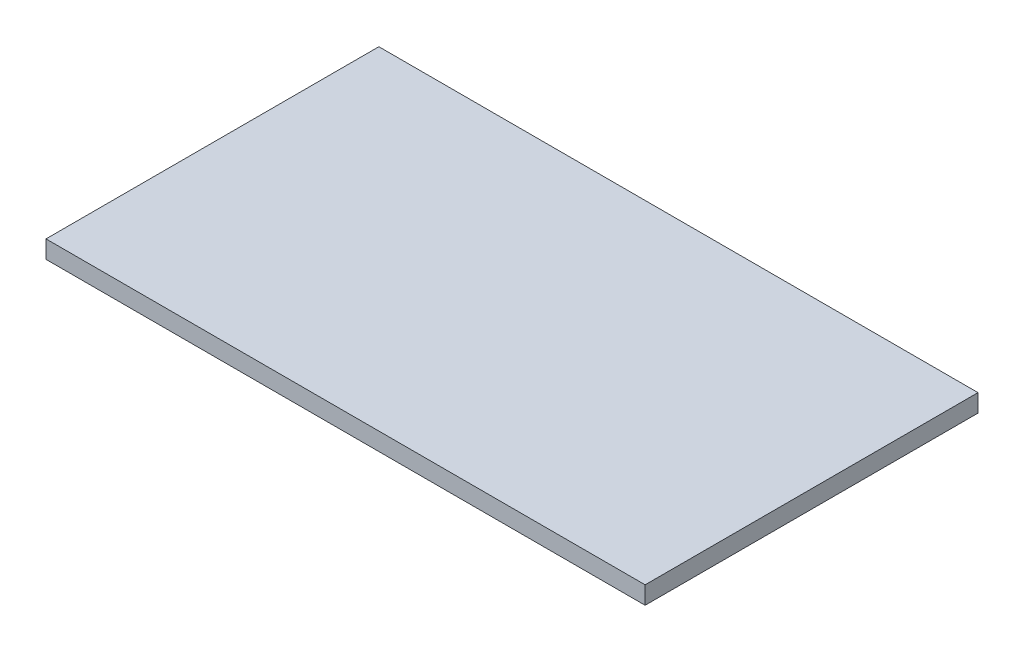
ISO-10303-21;
HEADER;
FILE_DESCRIPTION(('STEP AP214'),'2;1');
FILE_NAME('part.step','',(''),(''),'','','');
FILE_SCHEMA(('AUTOMOTIVE_DESIGN { 1 0 10303 214 1 1 1 1 }'));
ENDSEC;
DATA;
#1=APPLICATION_CONTEXT('core data for automotive mechanical design processes');
#2=APPLICATION_PROTOCOL_DEFINITION('international standard','automotive_design',2000,#1);
#3=PRODUCT_CONTEXT('',#1,'mechanical');
#4=PRODUCT('Part','Part','',(#3));
#5=PRODUCT_RELATED_PRODUCT_CATEGORY('part','',(#4));
#6=PRODUCT_DEFINITION_FORMATION('','',#4);
#7=PRODUCT_DEFINITION_CONTEXT('part definition',#1,'design');
#8=PRODUCT_DEFINITION('design','',#6,#7);
#9=PRODUCT_DEFINITION_SHAPE('','',#8);
#10=(LENGTH_UNIT() NAMED_UNIT(*) SI_UNIT(.MILLI.,.METRE.));
#11=(NAMED_UNIT(*) PLANE_ANGLE_UNIT() SI_UNIT($,.RADIAN.));
#12=(NAMED_UNIT(*) SI_UNIT($,.STERADIAN.) SOLID_ANGLE_UNIT());
#13=UNCERTAINTY_MEASURE_WITH_UNIT(LENGTH_MEASURE(1.E-05),#10,'distance_accuracy_value','');
#14=(GEOMETRIC_REPRESENTATION_CONTEXT(3) GLOBAL_UNCERTAINTY_ASSIGNED_CONTEXT((#13)) GLOBAL_UNIT_ASSIGNED_CONTEXT((#10,
#11,#12)) REPRESENTATION_CONTEXT('',''));
#15=CARTESIAN_POINT('',(0.,0.,0.));
#16=DIRECTION('',(0.,0.,1.));
#17=DIRECTION('',(1.,0.,0.));
#18=AXIS2_PLACEMENT_3D('',#15,#16,#17);
#19=CARTESIAN_POINT('',(-135.,8.,-75.));
#20=DIRECTION('',(1.,0.,0.));
#21=DIRECTION('',(0.,0.,-1.));
#22=AXIS2_PLACEMENT_3D('',#19,#20,#21);
#23=PLANE('',#22);
#24=DIRECTION('',(0.,0.,1.));
#25=VECTOR('',#24,1.);
#26=CARTESIAN_POINT('',(-135.,0.,-75.));
#27=LINE('',#26,#25);
#28=CARTESIAN_POINT('',(-135.,0.,-75.));
#29=VERTEX_POINT('',#28);
#30=CARTESIAN_POINT('',(-135.,0.,75.));
#31=VERTEX_POINT('',#30);
#32=EDGE_CURVE('E97',#29,#31,#27,.T.);
#33=ORIENTED_EDGE('',*,*,#32,.T.);
#34=DIRECTION('',(0.,-1.,0.));
#35=VECTOR('',#34,1.);
#36=CARTESIAN_POINT('',(-135.,8.,75.));
#37=LINE('',#36,#35);
#38=CARTESIAN_POINT('',(-135.,8.,75.));
#39=VERTEX_POINT('',#38);
#40=EDGE_CURVE('E11',#39,#31,#37,.T.);
#41=ORIENTED_EDGE('',*,*,#40,.F.);
#42=DIRECTION('',(0.,0.,1.));
#43=VECTOR('',#42,1.);
#44=CARTESIAN_POINT('',(-135.,8.,-75.));
#45=LINE('',#44,#43);
#46=CARTESIAN_POINT('',(-135.,8.,-75.));
#47=VERTEX_POINT('',#46);
#48=EDGE_CURVE('E85',#47,#39,#45,.T.);
#49=ORIENTED_EDGE('',*,*,#48,.F.);
#50=DIRECTION('',(0.,-1.,0.));
#51=VECTOR('',#50,1.);
#52=CARTESIAN_POINT('',(-135.,8.,-75.));
#53=LINE('',#52,#51);
#54=EDGE_CURVE('E93',#47,#29,#53,.T.);
#55=ORIENTED_EDGE('',*,*,#54,.T.);
#56=EDGE_LOOP('',(#33,#41,#49,#55));
#57=FACE_BOUND('',#56,.T.);
#58=ADVANCED_FACE('F34',(#57),#23,.F.);
#59=CARTESIAN_POINT('',(135.,8.,75.));
#60=DIRECTION('',(0.,0.,-1.));
#61=DIRECTION('',(-1.,0.,0.));
#62=AXIS2_PLACEMENT_3D('',#59,#60,#61);
#63=PLANE('',#62);
#64=DIRECTION('',(1.,0.,0.));
#65=VECTOR('',#64,1.);
#66=CARTESIAN_POINT('',(135.,0.,75.));
#67=LINE('',#66,#65);
#68=CARTESIAN_POINT('',(135.,0.,75.));
#69=VERTEX_POINT('',#68);
#70=EDGE_CURVE('E89',#31,#69,#67,.T.);
#71=ORIENTED_EDGE('',*,*,#70,.T.);
#72=DIRECTION('',(0.,-1.,0.));
#73=VECTOR('',#72,1.);
#74=CARTESIAN_POINT('',(135.,8.,75.));
#75=LINE('',#74,#73);
#76=CARTESIAN_POINT('',(135.,8.,75.));
#77=VERTEX_POINT('',#76);
#78=EDGE_CURVE('E42',#77,#69,#75,.T.);
#79=ORIENTED_EDGE('',*,*,#78,.F.);
#80=DIRECTION('',(1.,0.,0.));
#81=VECTOR('',#80,1.);
#82=CARTESIAN_POINT('',(135.,8.,75.));
#83=LINE('',#82,#81);
#84=EDGE_CURVE('E80',#39,#77,#83,.T.);
#85=ORIENTED_EDGE('',*,*,#84,.F.);
#86=ORIENTED_EDGE('',*,*,#40,.T.);
#87=EDGE_LOOP('',(#71,#79,#85,#86));
#88=FACE_BOUND('',#87,.T.);
#89=ADVANCED_FACE('F88',(#88),#63,.F.);
#90=CARTESIAN_POINT('',(135.,8.,-75.));
#91=DIRECTION('',(-1.,0.,0.));
#92=DIRECTION('',(0.,0.,1.));
#93=AXIS2_PLACEMENT_3D('',#90,#91,#92);
#94=PLANE('',#93);
#95=DIRECTION('',(0.,0.,-1.));
#96=VECTOR('',#95,1.);
#97=CARTESIAN_POINT('',(135.,0.,-75.));
#98=LINE('',#97,#96);
#99=CARTESIAN_POINT('',(135.,0.,-75.));
#100=VERTEX_POINT('',#99);
#101=EDGE_CURVE('E67',#69,#100,#98,.T.);
#102=ORIENTED_EDGE('',*,*,#101,.T.);
#103=DIRECTION('',(0.,-1.,0.));
#104=VECTOR('',#103,1.);
#105=CARTESIAN_POINT('',(135.,8.,-75.));
#106=LINE('',#105,#104);
#107=CARTESIAN_POINT('',(135.,8.,-75.));
#108=VERTEX_POINT('',#107);
#109=EDGE_CURVE('E90',#108,#100,#106,.T.);
#110=ORIENTED_EDGE('',*,*,#109,.F.);
#111=DIRECTION('',(0.,0.,-1.));
#112=VECTOR('',#111,1.);
#113=CARTESIAN_POINT('',(135.,8.,-75.));
#114=LINE('',#113,#112);
#115=EDGE_CURVE('E83',#77,#108,#114,.T.);
#116=ORIENTED_EDGE('',*,*,#115,.F.);
#117=ORIENTED_EDGE('',*,*,#78,.T.);
#118=EDGE_LOOP('',(#102,#110,#116,#117));
#119=FACE_BOUND('',#118,.T.);
#120=ADVANCED_FACE('F91',(#119),#94,.F.);
#121=CARTESIAN_POINT('',(135.,8.,-75.));
#122=DIRECTION('',(0.,0.,1.));
#123=DIRECTION('',(1.,0.,0.));
#124=AXIS2_PLACEMENT_3D('',#121,#122,#123);
#125=PLANE('',#124);
#126=DIRECTION('',(-1.,0.,0.));
#127=VECTOR('',#126,1.);
#128=CARTESIAN_POINT('',(135.,0.,-75.));
#129=LINE('',#128,#127);
#130=EDGE_CURVE('E73',#100,#29,#129,.T.);
#131=ORIENTED_EDGE('',*,*,#130,.T.);
#132=ORIENTED_EDGE('',*,*,#54,.F.);
#133=DIRECTION('',(-1.,0.,0.));
#134=VECTOR('',#133,1.);
#135=CARTESIAN_POINT('',(135.,8.,-75.));
#136=LINE('',#135,#134);
#137=EDGE_CURVE('E50',#108,#47,#136,.T.);
#138=ORIENTED_EDGE('',*,*,#137,.F.);
#139=ORIENTED_EDGE('',*,*,#109,.T.);
#140=EDGE_LOOP('',(#131,#132,#138,#139));
#141=FACE_BOUND('',#140,.T.);
#142=ADVANCED_FACE('F104',(#141),#125,.F.);
#143=CARTESIAN_POINT('',(0.,8.,0.));
#144=DIRECTION('',(0.,-1.,0.));
#145=DIRECTION('',(0.,0.,-1.));
#146=AXIS2_PLACEMENT_3D('',#143,#144,#145);
#147=PLANE('',#146);
#148=ORIENTED_EDGE('',*,*,#48,.T.);
#149=ORIENTED_EDGE('',*,*,#84,.T.);
#150=ORIENTED_EDGE('',*,*,#115,.T.);
#151=ORIENTED_EDGE('',*,*,#137,.T.);
#152=EDGE_LOOP('',(#148,#149,#150,#151));
#153=FACE_BOUND('',#152,.T.);
#154=ADVANCED_FACE('F81',(#153),#147,.F.);
#155=CARTESIAN_POINT('',(0.,0.,0.));
#156=DIRECTION('',(0.,-1.,0.));
#157=DIRECTION('',(0.,0.,-1.));
#158=AXIS2_PLACEMENT_3D('',#155,#156,#157);
#159=PLANE('',#158);
#160=ORIENTED_EDGE('',*,*,#32,.F.);
#161=ORIENTED_EDGE('',*,*,#130,.F.);
#162=ORIENTED_EDGE('',*,*,#101,.F.);
#163=ORIENTED_EDGE('',*,*,#70,.F.);
#164=EDGE_LOOP('',(#160,#161,#162,#163));
#165=FACE_BOUND('',#164,.T.);
#166=ADVANCED_FACE('F107',(#165),#159,.T.);
#167=CLOSED_SHELL('',(#58,#89,#120,#142,#154,#166));
#168=MANIFOLD_SOLID_BREP('B2',#167);
#169=ADVANCED_BREP_SHAPE_REPRESENTATION('',(#18,#168),#14);
#170=SHAPE_DEFINITION_REPRESENTATION(#9,#169);
ENDSEC;
END-ISO-10303-21;
